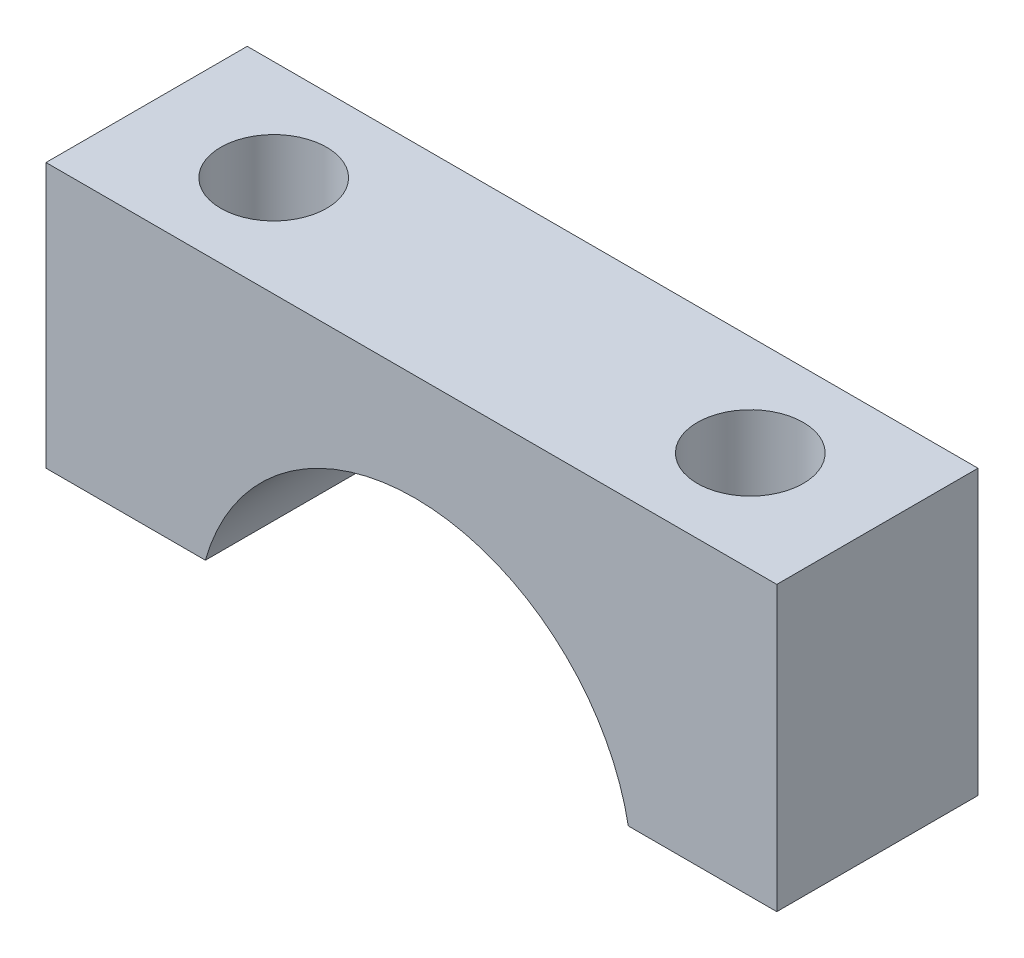
ISO-10303-21;
HEADER;
FILE_DESCRIPTION(('STEP AP214'),'2;1');
FILE_NAME('part.step','',(''),(''),'','','');
FILE_SCHEMA(('AUTOMOTIVE_DESIGN { 1 0 10303 214 1 1 1 1 }'));
ENDSEC;
DATA;
#1=APPLICATION_CONTEXT('core data for automotive mechanical design processes');
#2=APPLICATION_PROTOCOL_DEFINITION('international standard','automotive_design',2000,#1);
#3=PRODUCT_CONTEXT('',#1,'mechanical');
#4=PRODUCT('Part','Part','',(#3));
#5=PRODUCT_RELATED_PRODUCT_CATEGORY('part','',(#4));
#6=PRODUCT_DEFINITION_FORMATION('','',#4);
#7=PRODUCT_DEFINITION_CONTEXT('part definition',#1,'design');
#8=PRODUCT_DEFINITION('design','',#6,#7);
#9=PRODUCT_DEFINITION_SHAPE('','',#8);
#10=(LENGTH_UNIT() NAMED_UNIT(*) SI_UNIT(.MILLI.,.METRE.));
#11=(NAMED_UNIT(*) PLANE_ANGLE_UNIT() SI_UNIT($,.RADIAN.));
#12=(NAMED_UNIT(*) SI_UNIT($,.STERADIAN.) SOLID_ANGLE_UNIT());
#13=UNCERTAINTY_MEASURE_WITH_UNIT(LENGTH_MEASURE(1.E-05),#10,'distance_accuracy_value','');
#14=(GEOMETRIC_REPRESENTATION_CONTEXT(3) GLOBAL_UNCERTAINTY_ASSIGNED_CONTEXT((#13)) GLOBAL_UNIT_ASSIGNED_CONTEXT((#10,
#11,#12)) REPRESENTATION_CONTEXT('',''));
#15=CARTESIAN_POINT('',(0.,0.,0.));
#16=DIRECTION('',(0.,0.,1.));
#17=DIRECTION('',(1.,0.,0.));
#18=AXIS2_PLACEMENT_3D('',#15,#16,#17);
#19=CARTESIAN_POINT('',(2476.9918073562,1418.79319785399,9.652));
#20=DIRECTION('',(0.,1.,0.));
#21=DIRECTION('',(0.,0.,1.));
#22=AXIS2_PLACEMENT_3D('',#19,#20,#21);
#23=PLANE('',#22);
#24=DIRECTION('',(1.,0.,0.));
#25=VECTOR('',#24,1.);
#26=CARTESIAN_POINT('',(2476.9918073562,1418.79319785399,0.));
#27=LINE('',#26,#25);
#28=CARTESIAN_POINT('',(2476.9918073562,1418.79319785399,0.));
#29=VERTEX_POINT('',#28);
#30=CARTESIAN_POINT('',(2484.63757200341,1418.79319785399,0.));
#31=VERTEX_POINT('',#30);
#32=EDGE_CURVE('E130',#29,#31,#27,.T.);
#33=ORIENTED_EDGE('',*,*,#32,.T.);
#34=DIRECTION('',(0.,0.,-1.));
#35=VECTOR('',#34,1.);
#36=CARTESIAN_POINT('',(2484.63757200341,1418.79319785399,9.652));
#37=LINE('',#36,#35);
#38=CARTESIAN_POINT('',(2484.63757200341,1418.79319785399,9.652));
#39=VERTEX_POINT('',#38);
#40=EDGE_CURVE('E11',#39,#31,#37,.T.);
#41=ORIENTED_EDGE('',*,*,#40,.F.);
#42=DIRECTION('',(1.,0.,0.));
#43=VECTOR('',#42,1.);
#44=CARTESIAN_POINT('',(2476.9918073562,1418.79319785399,9.652));
#45=LINE('',#44,#43);
#46=CARTESIAN_POINT('',(2476.9918073562,1418.79319785399,9.652));
#47=VERTEX_POINT('',#46);
#48=EDGE_CURVE('E137',#47,#39,#45,.T.);
#49=ORIENTED_EDGE('',*,*,#48,.F.);
#50=DIRECTION('',(0.,0.,-1.));
#51=VECTOR('',#50,1.);
#52=CARTESIAN_POINT('',(2476.9918073562,1418.79319785399,9.652));
#53=LINE('',#52,#51);
#54=EDGE_CURVE('E123',#47,#29,#53,.T.);
#55=ORIENTED_EDGE('',*,*,#54,.T.);
#56=EDGE_LOOP('',(#33,#41,#49,#55));
#57=FACE_BOUND('',#56,.T.);
#58=ADVANCED_FACE('F43',(#57),#23,.F.);
#59=CARTESIAN_POINT('',(2494.67537921294,1415.97840783235,9.652));
#60=DIRECTION('',(0.,0.,-1.));
#61=DIRECTION('',(-1.,0.,0.));
#62=AXIS2_PLACEMENT_3D('',#59,#60,#61);
#63=CYLINDRICAL_SURFACE('',#62,10.4249995895302);
#64=CARTESIAN_POINT('',(2494.67537921294,1415.97840783235,0.));
#65=DIRECTION('',(0.,0.,-1.));
#66=DIRECTION('',(-1.,0.,0.));
#67=AXIS2_PLACEMENT_3D('',#64,#65,#66);
#68=CIRCLE('',#67,10.4249995895302);
#69=CARTESIAN_POINT('',(2504.92216143035,1417.8978011299,0.));
#70=VERTEX_POINT('',#69);
#71=EDGE_CURVE('E129',#31,#70,#68,.T.);
#72=ORIENTED_EDGE('',*,*,#71,.T.);
#73=DIRECTION('',(0.,0.,-1.));
#74=VECTOR('',#73,1.);
#75=CARTESIAN_POINT('',(2504.92216143035,1417.8978011299,9.652));
#76=LINE('',#75,#74);
#77=CARTESIAN_POINT('',(2504.92216143035,1417.8978011299,9.652));
#78=VERTEX_POINT('',#77);
#79=EDGE_CURVE('E51',#78,#70,#76,.T.);
#80=ORIENTED_EDGE('',*,*,#79,.F.);
#81=CARTESIAN_POINT('',(2494.67537921294,1415.97840783235,9.652));
#82=DIRECTION('',(0.,0.,-1.));
#83=DIRECTION('',(-1.,0.,0.));
#84=AXIS2_PLACEMENT_3D('',#81,#82,#83);
#85=CIRCLE('',#84,10.4249995895302);
#86=EDGE_CURVE('E98',#39,#78,#85,.T.);
#87=ORIENTED_EDGE('',*,*,#86,.F.);
#88=ORIENTED_EDGE('',*,*,#40,.T.);
#89=EDGE_LOOP('',(#72,#80,#87,#88));
#90=FACE_BOUND('',#89,.T.);
#91=ADVANCED_FACE('F163',(#90),#63,.F.);
#92=CARTESIAN_POINT('',(2512.0438073562,1417.8978011299,9.652));
#93=DIRECTION('',(0.,1.,0.));
#94=DIRECTION('',(0.,0.,1.));
#95=AXIS2_PLACEMENT_3D('',#92,#93,#94);
#96=PLANE('',#95);
#97=DIRECTION('',(1.,0.,0.));
#98=VECTOR('',#97,1.);
#99=CARTESIAN_POINT('',(2512.0438073562,1417.8978011299,0.));
#100=LINE('',#99,#98);
#101=CARTESIAN_POINT('',(2512.0438073562,1417.8978011299,0.));
#102=VERTEX_POINT('',#101);
#103=EDGE_CURVE('E134',#70,#102,#100,.T.);
#104=ORIENTED_EDGE('',*,*,#103,.T.);
#105=DIRECTION('',(0.,0.,-1.));
#106=VECTOR('',#105,1.);
#107=CARTESIAN_POINT('',(2512.0438073562,1417.8978011299,9.652));
#108=LINE('',#107,#106);
#109=CARTESIAN_POINT('',(2512.0438073562,1417.8978011299,9.652));
#110=VERTEX_POINT('',#109);
#111=EDGE_CURVE('E118',#110,#102,#108,.T.);
#112=ORIENTED_EDGE('',*,*,#111,.F.);
#113=DIRECTION('',(1.,0.,0.));
#114=VECTOR('',#113,1.);
#115=CARTESIAN_POINT('',(2512.0438073562,1417.8978011299,9.652));
#116=LINE('',#115,#114);
#117=EDGE_CURVE('E110',#78,#110,#116,.T.);
#118=ORIENTED_EDGE('',*,*,#117,.F.);
#119=ORIENTED_EDGE('',*,*,#79,.T.);
#120=EDGE_LOOP('',(#104,#112,#118,#119));
#121=FACE_BOUND('',#120,.T.);
#122=ADVANCED_FACE('F143',(#121),#96,.F.);
#123=CARTESIAN_POINT('',(2512.0438073562,1431.49319785399,9.652));
#124=DIRECTION('',(-1.,0.,0.));
#125=DIRECTION('',(0.,0.,1.));
#126=AXIS2_PLACEMENT_3D('',#123,#124,#125);
#127=PLANE('',#126);
#128=DIRECTION('',(0.,1.,0.));
#129=VECTOR('',#128,1.);
#130=CARTESIAN_POINT('',(2512.0438073562,1431.49319785399,0.));
#131=LINE('',#130,#129);
#132=CARTESIAN_POINT('',(2512.0438073562,1431.49319785399,0.));
#133=VERTEX_POINT('',#132);
#134=EDGE_CURVE('E120',#102,#133,#131,.T.);
#135=ORIENTED_EDGE('',*,*,#134,.T.);
#136=DIRECTION('',(0.,0.,-1.));
#137=VECTOR('',#136,1.);
#138=CARTESIAN_POINT('',(2512.0438073562,1431.49319785399,9.652));
#139=LINE('',#138,#137);
#140=CARTESIAN_POINT('',(2512.0438073562,1431.49319785399,9.652));
#141=VERTEX_POINT('',#140);
#142=EDGE_CURVE('E114',#141,#133,#139,.T.);
#143=ORIENTED_EDGE('',*,*,#142,.F.);
#144=DIRECTION('',(0.,1.,0.));
#145=VECTOR('',#144,1.);
#146=CARTESIAN_POINT('',(2512.0438073562,1431.49319785399,9.652));
#147=LINE('',#146,#145);
#148=EDGE_CURVE('E104',#110,#141,#147,.T.);
#149=ORIENTED_EDGE('',*,*,#148,.F.);
#150=ORIENTED_EDGE('',*,*,#111,.T.);
#151=EDGE_LOOP('',(#135,#143,#149,#150));
#152=FACE_BOUND('',#151,.T.);
#153=ADVANCED_FACE('F112',(#152),#127,.F.);
#154=CARTESIAN_POINT('',(2476.9918073562,1431.49319785399,9.652));
#155=DIRECTION('',(0.,-1.,0.));
#156=DIRECTION('',(0.,0.,-1.));
#157=AXIS2_PLACEMENT_3D('',#154,#155,#156);
#158=PLANE('',#157);
#159=CARTESIAN_POINT('',(2483.0878073562,1431.49319785399,4.826));
#160=DIRECTION('',(0.,1.,0.));
#161=DIRECTION('',(0.,0.,1.));
#162=AXIS2_PLACEMENT_3D('',#159,#160,#161);
#163=CIRCLE('',#162,2.54000000000008);
#164=CARTESIAN_POINT('',(2483.0878073562,1431.49319785399,7.36600000000008));
#165=VERTEX_POINT('',#164);
#166=EDGE_CURVE('E256',#165,#165,#163,.T.);
#167=ORIENTED_EDGE('',*,*,#166,.F.);
#168=EDGE_LOOP('',(#167));
#169=FACE_BOUND('',#168,.T.);
#170=CARTESIAN_POINT('',(2505.9478073562,1431.49319785399,4.826));
#171=DIRECTION('',(0.,1.,0.));
#172=DIRECTION('',(0.,0.,-1.));
#173=AXIS2_PLACEMENT_3D('',#170,#171,#172);
#174=CIRCLE('',#173,2.54000000000008);
#175=CARTESIAN_POINT('',(2505.9478073562,1431.49319785399,2.28599999999992));
#176=VERTEX_POINT('',#175);
#177=EDGE_CURVE('E263',#176,#176,#174,.T.);
#178=ORIENTED_EDGE('',*,*,#177,.F.);
#179=EDGE_LOOP('',(#178));
#180=FACE_BOUND('',#179,.T.);
#181=DIRECTION('',(-1.,0.,0.));
#182=VECTOR('',#181,1.);
#183=CARTESIAN_POINT('',(2476.9918073562,1431.49319785399,0.));
#184=LINE('',#183,#182);
#185=CARTESIAN_POINT('',(2476.9918073562,1431.49319785399,0.));
#186=VERTEX_POINT('',#185);
#187=EDGE_CURVE('E85',#133,#186,#184,.T.);
#188=ORIENTED_EDGE('',*,*,#187,.T.);
#189=DIRECTION('',(0.,0.,-1.));
#190=VECTOR('',#189,1.);
#191=CARTESIAN_POINT('',(2476.9918073562,1431.49319785399,9.652));
#192=LINE('',#191,#190);
#193=CARTESIAN_POINT('',(2476.9918073562,1431.49319785399,9.652));
#194=VERTEX_POINT('',#193);
#195=EDGE_CURVE('E117',#194,#186,#192,.T.);
#196=ORIENTED_EDGE('',*,*,#195,.F.);
#197=DIRECTION('',(-1.,0.,0.));
#198=VECTOR('',#197,1.);
#199=CARTESIAN_POINT('',(2476.9918073562,1431.49319785399,9.652));
#200=LINE('',#199,#198);
#201=EDGE_CURVE('E107',#141,#194,#200,.T.);
#202=ORIENTED_EDGE('',*,*,#201,.F.);
#203=ORIENTED_EDGE('',*,*,#142,.T.);
#204=EDGE_LOOP('',(#188,#196,#202,#203));
#205=FACE_BOUND('',#204,.T.);
#206=ADVANCED_FACE('F121',(#169,#180,#205),#158,.F.);
#207=CARTESIAN_POINT('',(2476.9918073562,1418.79319785399,9.652));
#208=DIRECTION('',(1.,0.,0.));
#209=DIRECTION('',(0.,0.,-1.));
#210=AXIS2_PLACEMENT_3D('',#207,#208,#209);
#211=PLANE('',#210);
#212=DIRECTION('',(0.,-1.,0.));
#213=VECTOR('',#212,1.);
#214=CARTESIAN_POINT('',(2476.9918073562,1418.79319785399,0.));
#215=LINE('',#214,#213);
#216=EDGE_CURVE('E87',#186,#29,#215,.T.);
#217=ORIENTED_EDGE('',*,*,#216,.T.);
#218=ORIENTED_EDGE('',*,*,#54,.F.);
#219=DIRECTION('',(0.,-1.,0.));
#220=VECTOR('',#219,1.);
#221=CARTESIAN_POINT('',(2476.9918073562,1418.79319785399,9.652));
#222=LINE('',#221,#220);
#223=EDGE_CURVE('E56',#194,#47,#222,.T.);
#224=ORIENTED_EDGE('',*,*,#223,.F.);
#225=ORIENTED_EDGE('',*,*,#195,.T.);
#226=EDGE_LOOP('',(#217,#218,#224,#225));
#227=FACE_BOUND('',#226,.T.);
#228=ADVANCED_FACE('F151',(#227),#211,.F.);
#229=CARTESIAN_POINT('',(2494.67537921294,1415.97840783235,9.652));
#230=DIRECTION('',(0.,0.,-1.));
#231=DIRECTION('',(-1.,0.,0.));
#232=AXIS2_PLACEMENT_3D('',#229,#230,#231);
#233=PLANE('',#232);
#234=ORIENTED_EDGE('',*,*,#48,.T.);
#235=ORIENTED_EDGE('',*,*,#86,.T.);
#236=ORIENTED_EDGE('',*,*,#117,.T.);
#237=ORIENTED_EDGE('',*,*,#148,.T.);
#238=ORIENTED_EDGE('',*,*,#201,.T.);
#239=ORIENTED_EDGE('',*,*,#223,.T.);
#240=EDGE_LOOP('',(#234,#235,#236,#237,#238,#239));
#241=FACE_BOUND('',#240,.T.);
#242=ADVANCED_FACE('F105',(#241),#233,.F.);
#243=CARTESIAN_POINT('',(2494.67537921294,1415.97840783235,0.));
#244=DIRECTION('',(0.,0.,-1.));
#245=DIRECTION('',(-1.,0.,0.));
#246=AXIS2_PLACEMENT_3D('',#243,#244,#245);
#247=PLANE('',#246);
#248=ORIENTED_EDGE('',*,*,#32,.F.);
#249=ORIENTED_EDGE('',*,*,#216,.F.);
#250=ORIENTED_EDGE('',*,*,#187,.F.);
#251=ORIENTED_EDGE('',*,*,#134,.F.);
#252=ORIENTED_EDGE('',*,*,#103,.F.);
#253=ORIENTED_EDGE('',*,*,#71,.F.);
#254=EDGE_LOOP('',(#248,#249,#250,#251,#252,#253));
#255=FACE_BOUND('',#254,.T.);
#256=ADVANCED_FACE('F150',(#255),#247,.T.);
#257=CARTESIAN_POINT('',(2505.9478073562,1426.41319785399,4.826));
#258=DIRECTION('',(0.,1.,0.));
#259=DIRECTION('',(0.,0.,1.));
#260=AXIS2_PLACEMENT_3D('',#257,#258,#259);
#261=CYLINDRICAL_SURFACE('',#260,2.54000000000008);
#262=CARTESIAN_POINT('',(2505.9478073562,1426.41319785399,4.826));
#263=DIRECTION('',(0.,1.,0.));
#264=DIRECTION('',(0.,0.,-1.));
#265=AXIS2_PLACEMENT_3D('',#262,#263,#264);
#266=CIRCLE('',#265,2.54000000000008);
#267=CARTESIAN_POINT('',(2505.9478073562,1426.41319785399,2.28599999999992));
#268=VERTEX_POINT('',#267);
#269=EDGE_CURVE('E266',#268,#268,#266,.T.);
#270=ORIENTED_EDGE('',*,*,#269,.F.);
#271=EDGE_LOOP('',(#270));
#272=FACE_BOUND('',#271,.T.);
#273=ORIENTED_EDGE('',*,*,#177,.T.);
#274=EDGE_LOOP('',(#273));
#275=FACE_BOUND('',#274,.T.);
#276=ADVANCED_FACE('F215',(#272,#275),#261,.F.);
#277=CARTESIAN_POINT('',(2505.9478073562,1426.41319785399,4.826));
#278=DIRECTION('',(0.,-1.,0.));
#279=DIRECTION('',(0.,0.,-1.));
#280=AXIS2_PLACEMENT_3D('',#277,#278,#279);
#281=PLANE('',#280);
#282=ORIENTED_EDGE('',*,*,#269,.T.);
#283=EDGE_LOOP('',(#282));
#284=FACE_BOUND('',#283,.T.);
#285=ADVANCED_FACE('F218',(#284),#281,.F.);
#286=CARTESIAN_POINT('',(2483.0878073562,1426.41319785399,4.826));
#287=DIRECTION('',(0.,1.,0.));
#288=DIRECTION('',(0.,0.,1.));
#289=AXIS2_PLACEMENT_3D('',#286,#287,#288);
#290=CYLINDRICAL_SURFACE('',#289,2.54000000000008);
#291=CARTESIAN_POINT('',(2483.0878073562,1426.41319785399,4.826));
#292=DIRECTION('',(0.,1.,0.));
#293=DIRECTION('',(0.,0.,1.));
#294=AXIS2_PLACEMENT_3D('',#291,#292,#293);
#295=CIRCLE('',#294,2.54000000000008);
#296=CARTESIAN_POINT('',(2483.0878073562,1426.41319785399,7.36600000000008));
#297=VERTEX_POINT('',#296);
#298=EDGE_CURVE('E132',#297,#297,#295,.T.);
#299=ORIENTED_EDGE('',*,*,#298,.F.);
#300=EDGE_LOOP('',(#299));
#301=FACE_BOUND('',#300,.T.);
#302=ORIENTED_EDGE('',*,*,#166,.T.);
#303=EDGE_LOOP('',(#302));
#304=FACE_BOUND('',#303,.T.);
#305=ADVANCED_FACE('F229',(#301,#304),#290,.F.);
#306=CARTESIAN_POINT('',(2483.0878073562,1426.41319785399,4.826));
#307=DIRECTION('',(0.,1.,0.));
#308=DIRECTION('',(0.,0.,1.));
#309=AXIS2_PLACEMENT_3D('',#306,#307,#308);
#310=PLANE('',#309);
#311=ORIENTED_EDGE('',*,*,#298,.T.);
#312=EDGE_LOOP('',(#311));
#313=FACE_BOUND('',#312,.T.);
#314=ADVANCED_FACE('F240',(#313),#310,.T.);
#315=CLOSED_SHELL('',(#58,#91,#122,#153,#206,#228,#242,#256,#276,#285,#305,#314));
#316=MANIFOLD_SOLID_BREP('B2',#315);
#317=ADVANCED_BREP_SHAPE_REPRESENTATION('',(#18,#316),#14);
#318=SHAPE_DEFINITION_REPRESENTATION(#9,#317);
ENDSEC;
END-ISO-10303-21;
